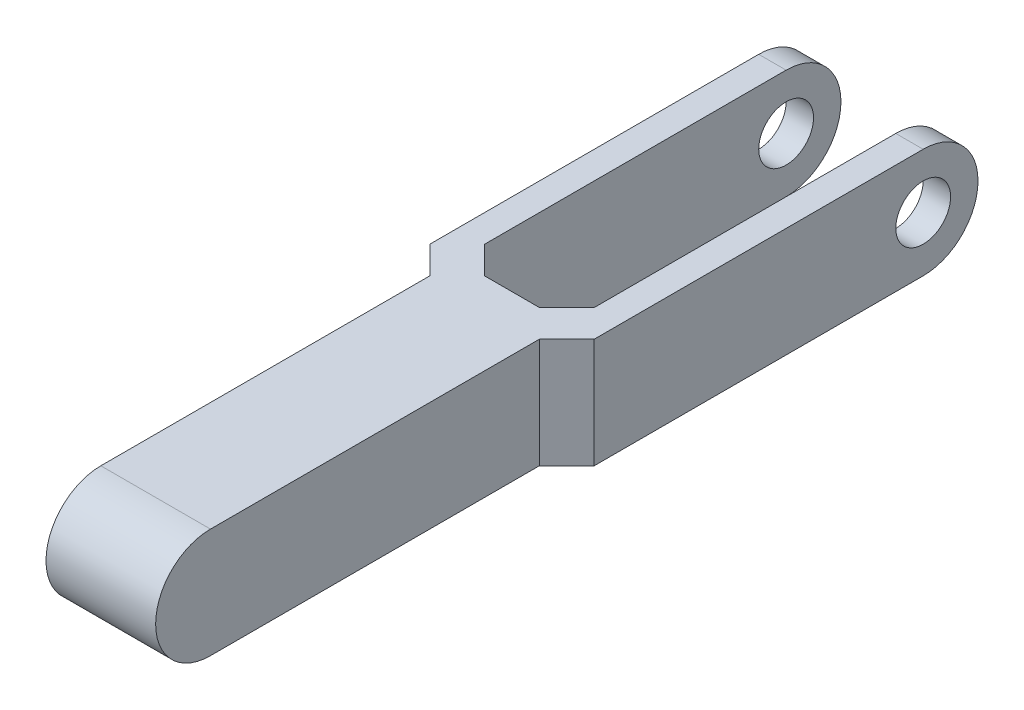
ISO-10303-21;
HEADER;
FILE_DESCRIPTION(('STEP AP214'),'2;1');
FILE_NAME('part.step','',(''),(''),'','','');
FILE_SCHEMA(('AUTOMOTIVE_DESIGN { 1 0 10303 214 1 1 1 1 }'));
ENDSEC;
DATA;
#1=APPLICATION_CONTEXT('core data for automotive mechanical design processes');
#2=APPLICATION_PROTOCOL_DEFINITION('international standard','automotive_design',2000,#1);
#3=PRODUCT_CONTEXT('',#1,'mechanical');
#4=PRODUCT('Part','Part','',(#3));
#5=PRODUCT_RELATED_PRODUCT_CATEGORY('part','',(#4));
#6=PRODUCT_DEFINITION_FORMATION('','',#4);
#7=PRODUCT_DEFINITION_CONTEXT('part definition',#1,'design');
#8=PRODUCT_DEFINITION('design','',#6,#7);
#9=PRODUCT_DEFINITION_SHAPE('','',#8);
#10=(LENGTH_UNIT() NAMED_UNIT(*) SI_UNIT(.MILLI.,.METRE.));
#11=(NAMED_UNIT(*) PLANE_ANGLE_UNIT() SI_UNIT($,.RADIAN.));
#12=(NAMED_UNIT(*) SI_UNIT($,.STERADIAN.) SOLID_ANGLE_UNIT());
#13=UNCERTAINTY_MEASURE_WITH_UNIT(LENGTH_MEASURE(1.E-05),#10,'distance_accuracy_value','');
#14=(GEOMETRIC_REPRESENTATION_CONTEXT(3) GLOBAL_UNCERTAINTY_ASSIGNED_CONTEXT((#13)) GLOBAL_UNIT_ASSIGNED_CONTEXT((#10,
#11,#12)) REPRESENTATION_CONTEXT('',''));
#15=CARTESIAN_POINT('',(0.,0.,0.));
#16=DIRECTION('',(0.,0.,1.));
#17=DIRECTION('',(1.,0.,0.));
#18=AXIS2_PLACEMENT_3D('',#15,#16,#17);
#19=CARTESIAN_POINT('',(30.,0.,0.));
#20=DIRECTION('',(-1.,0.,0.));
#21=DIRECTION('',(0.,0.,1.));
#22=AXIS2_PLACEMENT_3D('',#19,#20,#21);
#23=CYLINDRICAL_SURFACE('',#22,20.);
#24=CARTESIAN_POINT('',(20.0000000000001,0.,0.));
#25=DIRECTION('',(1.,0.,0.));
#26=DIRECTION('',(0.,0.,-1.));
#27=AXIS2_PLACEMENT_3D('',#24,#25,#26);
#28=CIRCLE('',#27,20.);
#29=CARTESIAN_POINT('',(20.0000000000001,20.,0.));
#30=VERTEX_POINT('',#29);
#31=CARTESIAN_POINT('',(20.0000000000001,-20.,0.));
#32=VERTEX_POINT('',#31);
#33=EDGE_CURVE('E11',#30,#32,#28,.T.);
#34=ORIENTED_EDGE('',*,*,#33,.F.);
#35=DIRECTION('',(-1.,0.,0.));
#36=VECTOR('',#35,1.);
#37=CARTESIAN_POINT('',(30.,20.,0.));
#38=LINE('',#37,#36);
#39=CARTESIAN_POINT('',(-20.,20.,0.));
#40=VERTEX_POINT('',#39);
#41=EDGE_CURVE('E182',#30,#40,#38,.T.);
#42=ORIENTED_EDGE('',*,*,#41,.T.);
#43=CARTESIAN_POINT('',(-20.,0.,0.));
#44=DIRECTION('',(1.,0.,0.));
#45=DIRECTION('',(0.,0.,-1.));
#46=AXIS2_PLACEMENT_3D('',#43,#44,#45);
#47=CIRCLE('',#46,20.);
#48=CARTESIAN_POINT('',(-20.,-20.,0.));
#49=VERTEX_POINT('',#48);
#50=EDGE_CURVE('E51',#40,#49,#47,.T.);
#51=ORIENTED_EDGE('',*,*,#50,.T.);
#52=DIRECTION('',(-1.,0.,0.));
#53=VECTOR('',#52,1.);
#54=CARTESIAN_POINT('',(30.,-20.,0.));
#55=LINE('',#54,#53);
#56=EDGE_CURVE('E192',#32,#49,#55,.T.);
#57=ORIENTED_EDGE('',*,*,#56,.F.);
#58=EDGE_LOOP('',(#34,#42,#51,#57));
#59=FACE_BOUND('',#58,.T.);
#60=ADVANCED_FACE('F43',(#59),#23,.T.);
#61=CARTESIAN_POINT('',(30.,-20.,0.));
#62=DIRECTION('',(0.,1.,0.));
#63=DIRECTION('',(0.,0.,1.));
#64=AXIS2_PLACEMENT_3D('',#61,#62,#63);
#65=PLANE('',#64);
#66=DIRECTION('',(0.707106781186547,0.,-0.707106781186548));
#67=VECTOR('',#66,1.);
#68=CARTESIAN_POINT('',(-50.,-20.,-49.9999999999999));
#69=LINE('',#68,#67);
#70=CARTESIAN_POINT('',(20.,-20.,-120.));
#71=VERTEX_POINT('',#70);
#72=CARTESIAN_POINT('',(30.,-20.,-130.));
#73=VERTEX_POINT('',#72);
#74=EDGE_CURVE('E296',#71,#73,#69,.T.);
#75=ORIENTED_EDGE('',*,*,#74,.F.);
#76=DIRECTION('',(0.,0.,-1.));
#77=VECTOR('',#76,1.);
#78=CARTESIAN_POINT('',(20.0000000000001,-20.,0.));
#79=LINE('',#78,#77);
#80=EDGE_CURVE('E299',#32,#71,#79,.T.);
#81=ORIENTED_EDGE('',*,*,#80,.F.);
#82=ORIENTED_EDGE('',*,*,#56,.T.);
#83=DIRECTION('',(0.,0.,-1.));
#84=VECTOR('',#83,1.);
#85=CARTESIAN_POINT('',(-20.,-20.,0.));
#86=LINE('',#85,#84);
#87=CARTESIAN_POINT('',(-20.,-20.,-120.));
#88=VERTEX_POINT('',#87);
#89=EDGE_CURVE('E59',#49,#88,#86,.T.);
#90=ORIENTED_EDGE('',*,*,#89,.T.);
#91=DIRECTION('',(0.707106781186547,0.,0.707106781186549));
#92=VECTOR('',#91,1.);
#93=CARTESIAN_POINT('',(50.,-20.,-49.9999999999998));
#94=LINE('',#93,#92);
#95=CARTESIAN_POINT('',(-30.,-20.,-130.));
#96=VERTEX_POINT('',#95);
#97=EDGE_CURVE('E146',#96,#88,#94,.T.);
#98=ORIENTED_EDGE('',*,*,#97,.F.);
#99=DIRECTION('',(0.,0.,-1.));
#100=VECTOR('',#99,1.);
#101=CARTESIAN_POINT('',(-30.,-20.,0.));
#102=LINE('',#101,#100);
#103=CARTESIAN_POINT('',(-30.,-20.,-250.));
#104=VERTEX_POINT('',#103);
#105=EDGE_CURVE('E165',#96,#104,#102,.T.);
#106=ORIENTED_EDGE('',*,*,#105,.T.);
#107=DIRECTION('',(-1.,0.,0.));
#108=VECTOR('',#107,1.);
#109=CARTESIAN_POINT('',(30.,-20.,-250.));
#110=LINE('',#109,#108);
#111=CARTESIAN_POINT('',(-20.,-20.,-250.));
#112=VERTEX_POINT('',#111);
#113=EDGE_CURVE('E188',#112,#104,#110,.T.);
#114=ORIENTED_EDGE('',*,*,#113,.F.);
#115=DIRECTION('',(0.,0.,1.));
#116=VECTOR('',#115,1.);
#117=CARTESIAN_POINT('',(-20.,-20.,0.));
#118=LINE('',#117,#116);
#119=CARTESIAN_POINT('',(-20.,-20.,-140.));
#120=VERTEX_POINT('',#119);
#121=EDGE_CURVE('E261',#112,#120,#118,.T.);
#122=ORIENTED_EDGE('',*,*,#121,.T.);
#123=DIRECTION('',(0.707106781186547,0.,0.707106781186549));
#124=VECTOR('',#123,1.);
#125=CARTESIAN_POINT('',(60.,-20.,-59.9999999999998));
#126=LINE('',#125,#124);
#127=CARTESIAN_POINT('',(-10.,-20.,-130.));
#128=VERTEX_POINT('',#127);
#129=EDGE_CURVE('E262',#120,#128,#126,.T.);
#130=ORIENTED_EDGE('',*,*,#129,.T.);
#131=DIRECTION('',(1.,0.,0.));
#132=VECTOR('',#131,1.);
#133=CARTESIAN_POINT('',(0.,-20.,-130.));
#134=LINE('',#133,#132);
#135=CARTESIAN_POINT('',(9.9999999999999,-20.,-130.));
#136=VERTEX_POINT('',#135);
#137=EDGE_CURVE('E271',#128,#136,#134,.T.);
#138=ORIENTED_EDGE('',*,*,#137,.T.);
#139=DIRECTION('',(-0.707106781186549,0.,0.707106781186546));
#140=VECTOR('',#139,1.);
#141=CARTESIAN_POINT('',(-60.0000000000001,-20.,-60.0000000000003));
#142=LINE('',#141,#140);
#143=CARTESIAN_POINT('',(20.0000000000001,-20.,-140.));
#144=VERTEX_POINT('',#143);
#145=EDGE_CURVE('E215',#144,#136,#142,.T.);
#146=ORIENTED_EDGE('',*,*,#145,.F.);
#147=DIRECTION('',(0.,0.,1.));
#148=VECTOR('',#147,1.);
#149=CARTESIAN_POINT('',(20.0000000000002,-20.,0.));
#150=LINE('',#149,#148);
#151=CARTESIAN_POINT('',(20.,-20.,-250.));
#152=VERTEX_POINT('',#151);
#153=EDGE_CURVE('E225',#152,#144,#150,.T.);
#154=ORIENTED_EDGE('',*,*,#153,.F.);
#155=CARTESIAN_POINT('',(30.,-20.,-250.));
#156=VERTEX_POINT('',#155);
#157=EDGE_CURVE('E190',#156,#152,#110,.T.);
#158=ORIENTED_EDGE('',*,*,#157,.F.);
#159=DIRECTION('',(0.,0.,-1.));
#160=VECTOR('',#159,1.);
#161=CARTESIAN_POINT('',(30.,-20.,0.));
#162=LINE('',#161,#160);
#163=EDGE_CURVE('E235',#73,#156,#162,.T.);
#164=ORIENTED_EDGE('',*,*,#163,.F.);
#165=EDGE_LOOP('',(#75,#81,#82,#90,#98,#106,#114,#122,#130,#138,#146,#154,#158,#164));
#166=FACE_BOUND('',#165,.T.);
#167=ADVANCED_FACE('F159',(#166),#65,.F.);
#168=CARTESIAN_POINT('',(30.,0.,-250.));
#169=DIRECTION('',(-1.,0.,0.));
#170=DIRECTION('',(0.,0.,1.));
#171=AXIS2_PLACEMENT_3D('',#168,#169,#170);
#172=CYLINDRICAL_SURFACE('',#171,20.);
#173=CARTESIAN_POINT('',(20.,0.,-250.));
#174=DIRECTION('',(-1.,0.,0.));
#175=DIRECTION('',(0.,0.,1.));
#176=AXIS2_PLACEMENT_3D('',#173,#174,#175);
#177=CIRCLE('',#176,20.);
#178=CARTESIAN_POINT('',(20.,20.,-250.));
#179=VERTEX_POINT('',#178);
#180=EDGE_CURVE('E175',#179,#152,#177,.T.);
#181=ORIENTED_EDGE('',*,*,#180,.F.);
#182=DIRECTION('',(-1.,0.,0.));
#183=VECTOR('',#182,1.);
#184=CARTESIAN_POINT('',(30.,20.,-250.));
#185=LINE('',#184,#183);
#186=CARTESIAN_POINT('',(30.,20.,-250.));
#187=VERTEX_POINT('',#186);
#188=EDGE_CURVE('E186',#187,#179,#185,.T.);
#189=ORIENTED_EDGE('',*,*,#188,.F.);
#190=CARTESIAN_POINT('',(30.,0.,-250.));
#191=DIRECTION('',(1.,0.,0.));
#192=DIRECTION('',(0.,0.,-1.));
#193=AXIS2_PLACEMENT_3D('',#190,#191,#192);
#194=CIRCLE('',#193,20.);
#195=EDGE_CURVE('E237',#156,#187,#194,.T.);
#196=ORIENTED_EDGE('',*,*,#195,.F.);
#197=ORIENTED_EDGE('',*,*,#157,.T.);
#198=EDGE_LOOP('',(#181,#189,#196,#197));
#199=FACE_BOUND('',#198,.T.);
#200=ADVANCED_FACE('F255',(#199),#172,.T.);
#201=CARTESIAN_POINT('',(-20.,20.,-250.));
#202=VERTEX_POINT('',#201);
#203=CARTESIAN_POINT('',(-30.,20.,-250.));
#204=VERTEX_POINT('',#203);
#205=EDGE_CURVE('E184',#202,#204,#185,.T.);
#206=ORIENTED_EDGE('',*,*,#205,.F.);
#207=CARTESIAN_POINT('',(-20.,0.,-250.));
#208=DIRECTION('',(-1.,0.,0.));
#209=DIRECTION('',(0.,0.,1.));
#210=AXIS2_PLACEMENT_3D('',#207,#208,#209);
#211=CIRCLE('',#210,20.);
#212=EDGE_CURVE('E200',#202,#112,#211,.T.);
#213=ORIENTED_EDGE('',*,*,#212,.T.);
#214=ORIENTED_EDGE('',*,*,#113,.T.);
#215=CARTESIAN_POINT('',(-30.,0.,-250.));
#216=DIRECTION('',(1.,0.,0.));
#217=DIRECTION('',(0.,0.,-1.));
#218=AXIS2_PLACEMENT_3D('',#215,#216,#217);
#219=CIRCLE('',#218,20.);
#220=EDGE_CURVE('E166',#104,#204,#219,.T.);
#221=ORIENTED_EDGE('',*,*,#220,.T.);
#222=EDGE_LOOP('',(#206,#213,#214,#221));
#223=FACE_BOUND('',#222,.T.);
#224=ADVANCED_FACE('F289',(#223),#172,.T.);
#225=CARTESIAN_POINT('',(30.,0.,-250.));
#226=DIRECTION('',(-1.,0.,0.));
#227=DIRECTION('',(0.,0.,1.));
#228=AXIS2_PLACEMENT_3D('',#225,#226,#227);
#229=CYLINDRICAL_SURFACE('',#228,9.99999999999998);
#230=CARTESIAN_POINT('',(30.,0.,-250.));
#231=DIRECTION('',(1.,0.,0.));
#232=DIRECTION('',(0.,0.,-1.));
#233=AXIS2_PLACEMENT_3D('',#230,#231,#232);
#234=CIRCLE('',#233,9.99999999999998);
#235=CARTESIAN_POINT('',(30.,0.,-260.));
#236=VERTEX_POINT('',#235);
#237=EDGE_CURVE('E176',#236,#236,#234,.T.);
#238=ORIENTED_EDGE('',*,*,#237,.T.);
#239=EDGE_LOOP('',(#238));
#240=FACE_BOUND('',#239,.T.);
#241=CARTESIAN_POINT('',(20.,0.,-250.));
#242=DIRECTION('',(-1.,0.,0.));
#243=DIRECTION('',(0.,0.,1.));
#244=AXIS2_PLACEMENT_3D('',#241,#242,#243);
#245=CIRCLE('',#244,9.99999999999998);
#246=CARTESIAN_POINT('',(20.,0.,-240.));
#247=VERTEX_POINT('',#246);
#248=EDGE_CURVE('E203',#247,#247,#245,.T.);
#249=ORIENTED_EDGE('',*,*,#248,.T.);
#250=EDGE_LOOP('',(#249));
#251=FACE_BOUND('',#250,.T.);
#252=ADVANCED_FACE('F317',(#240,#251),#229,.F.);
#253=CARTESIAN_POINT('',(30.,20.,0.));
#254=DIRECTION('',(0.,1.,0.));
#255=DIRECTION('',(0.,0.,1.));
#256=AXIS2_PLACEMENT_3D('',#253,#254,#255);
#257=PLANE('',#256);
#258=DIRECTION('',(0.,0.,-1.));
#259=VECTOR('',#258,1.);
#260=CARTESIAN_POINT('',(20.0000000000001,20.,0.));
#261=LINE('',#260,#259);
#262=CARTESIAN_POINT('',(20.,20.,-120.));
#263=VERTEX_POINT('',#262);
#264=EDGE_CURVE('E298',#30,#263,#261,.T.);
#265=ORIENTED_EDGE('',*,*,#264,.T.);
#266=DIRECTION('',(0.707106781186547,0.,-0.707106781186548));
#267=VECTOR('',#266,1.);
#268=CARTESIAN_POINT('',(-50.,20.,-49.9999999999999));
#269=LINE('',#268,#267);
#270=CARTESIAN_POINT('',(30.,20.,-130.));
#271=VERTEX_POINT('',#270);
#272=EDGE_CURVE('E243',#263,#271,#269,.T.);
#273=ORIENTED_EDGE('',*,*,#272,.T.);
#274=DIRECTION('',(0.,0.,-1.));
#275=VECTOR('',#274,1.);
#276=CARTESIAN_POINT('',(30.,20.,0.));
#277=LINE('',#276,#275);
#278=EDGE_CURVE('E183',#271,#187,#277,.T.);
#279=ORIENTED_EDGE('',*,*,#278,.T.);
#280=ORIENTED_EDGE('',*,*,#188,.T.);
#281=DIRECTION('',(0.,0.,1.));
#282=VECTOR('',#281,1.);
#283=CARTESIAN_POINT('',(20.0000000000002,20.,0.));
#284=LINE('',#283,#282);
#285=CARTESIAN_POINT('',(20.0000000000001,20.,-140.));
#286=VERTEX_POINT('',#285);
#287=EDGE_CURVE('E201',#179,#286,#284,.T.);
#288=ORIENTED_EDGE('',*,*,#287,.T.);
#289=DIRECTION('',(-0.707106781186549,0.,0.707106781186546));
#290=VECTOR('',#289,1.);
#291=CARTESIAN_POINT('',(-60.0000000000001,20.,-60.0000000000003));
#292=LINE('',#291,#290);
#293=CARTESIAN_POINT('',(9.9999999999999,20.,-130.));
#294=VERTEX_POINT('',#293);
#295=EDGE_CURVE('E219',#286,#294,#292,.T.);
#296=ORIENTED_EDGE('',*,*,#295,.T.);
#297=DIRECTION('',(1.,0.,0.));
#298=VECTOR('',#297,1.);
#299=CARTESIAN_POINT('',(0.,20.,-130.));
#300=LINE('',#299,#298);
#301=CARTESIAN_POINT('',(-10.,20.,-130.));
#302=VERTEX_POINT('',#301);
#303=EDGE_CURVE('E220',#302,#294,#300,.T.);
#304=ORIENTED_EDGE('',*,*,#303,.F.);
#305=DIRECTION('',(0.707106781186547,0.,0.707106781186549));
#306=VECTOR('',#305,1.);
#307=CARTESIAN_POINT('',(60.,20.,-59.9999999999998));
#308=LINE('',#307,#306);
#309=CARTESIAN_POINT('',(-19.9999999999999,20.,-140.));
#310=VERTEX_POINT('',#309);
#311=EDGE_CURVE('E214',#310,#302,#308,.T.);
#312=ORIENTED_EDGE('',*,*,#311,.F.);
#313=DIRECTION('',(0.,0.,1.));
#314=VECTOR('',#313,1.);
#315=CARTESIAN_POINT('',(-20.,20.,0.));
#316=LINE('',#315,#314);
#317=EDGE_CURVE('E191',#202,#310,#316,.T.);
#318=ORIENTED_EDGE('',*,*,#317,.F.);
#319=ORIENTED_EDGE('',*,*,#205,.T.);
#320=DIRECTION('',(0.,0.,-1.));
#321=VECTOR('',#320,1.);
#322=CARTESIAN_POINT('',(-30.,20.,0.));
#323=LINE('',#322,#321);
#324=CARTESIAN_POINT('',(-30.,20.,-130.));
#325=VERTEX_POINT('',#324);
#326=EDGE_CURVE('E172',#325,#204,#323,.T.);
#327=ORIENTED_EDGE('',*,*,#326,.F.);
#328=DIRECTION('',(0.707106781186547,0.,0.707106781186549));
#329=VECTOR('',#328,1.);
#330=CARTESIAN_POINT('',(50.,20.,-49.9999999999998));
#331=LINE('',#330,#329);
#332=CARTESIAN_POINT('',(-20.,20.,-120.));
#333=VERTEX_POINT('',#332);
#334=EDGE_CURVE('E147',#325,#333,#331,.T.);
#335=ORIENTED_EDGE('',*,*,#334,.T.);
#336=DIRECTION('',(0.,0.,-1.));
#337=VECTOR('',#336,1.);
#338=CARTESIAN_POINT('',(-20.,20.,0.));
#339=LINE('',#338,#337);
#340=EDGE_CURVE('E164',#40,#333,#339,.T.);
#341=ORIENTED_EDGE('',*,*,#340,.F.);
#342=ORIENTED_EDGE('',*,*,#41,.F.);
#343=EDGE_LOOP('',(#265,#273,#279,#280,#288,#296,#304,#312,#318,#319,#327,#335,#341,#342));
#344=FACE_BOUND('',#343,.T.);
#345=ADVANCED_FACE('F241',(#344),#257,.T.);
#346=CARTESIAN_POINT('',(-20.,0.,-250.));
#347=DIRECTION('',(-1.,0.,0.));
#348=DIRECTION('',(0.,0.,1.));
#349=AXIS2_PLACEMENT_3D('',#346,#347,#348);
#350=CIRCLE('',#349,9.99999999999998);
#351=CARTESIAN_POINT('',(-20.,0.,-240.));
#352=VERTEX_POINT('',#351);
#353=EDGE_CURVE('E198',#352,#352,#350,.T.);
#354=ORIENTED_EDGE('',*,*,#353,.F.);
#355=EDGE_LOOP('',(#354));
#356=FACE_BOUND('',#355,.T.);
#357=CARTESIAN_POINT('',(-30.,0.,-250.));
#358=DIRECTION('',(1.,0.,0.));
#359=DIRECTION('',(0.,0.,-1.));
#360=AXIS2_PLACEMENT_3D('',#357,#358,#359);
#361=CIRCLE('',#360,9.99999999999998);
#362=CARTESIAN_POINT('',(-30.,0.,-260.));
#363=VERTEX_POINT('',#362);
#364=EDGE_CURVE('E168',#363,#363,#361,.T.);
#365=ORIENTED_EDGE('',*,*,#364,.F.);
#366=EDGE_LOOP('',(#365));
#367=FACE_BOUND('',#366,.T.);
#368=ADVANCED_FACE('F44',(#356,#367),#229,.F.);
#369=CARTESIAN_POINT('',(30.,0.,0.));
#370=DIRECTION('',(1.,0.,0.));
#371=DIRECTION('',(0.,0.,-1.));
#372=AXIS2_PLACEMENT_3D('',#369,#370,#371);
#373=PLANE('',#372);
#374=DIRECTION('',(0.,1.,0.));
#375=VECTOR('',#374,1.);
#376=CARTESIAN_POINT('',(30.,-20.,-130.));
#377=LINE('',#376,#375);
#378=EDGE_CURVE('E286',#73,#271,#377,.T.);
#379=ORIENTED_EDGE('',*,*,#378,.F.);
#380=ORIENTED_EDGE('',*,*,#163,.T.);
#381=ORIENTED_EDGE('',*,*,#195,.T.);
#382=ORIENTED_EDGE('',*,*,#278,.F.);
#383=EDGE_LOOP('',(#379,#380,#381,#382));
#384=FACE_BOUND('',#383,.T.);
#385=ORIENTED_EDGE('',*,*,#237,.F.);
#386=EDGE_LOOP('',(#385));
#387=FACE_BOUND('',#386,.T.);
#388=ADVANCED_FACE('F247',(#384,#387),#373,.T.);
#389=CARTESIAN_POINT('',(-30.,0.,0.));
#390=DIRECTION('',(1.,0.,0.));
#391=DIRECTION('',(0.,0.,-1.));
#392=AXIS2_PLACEMENT_3D('',#389,#390,#391);
#393=PLANE('',#392);
#394=ORIENTED_EDGE('',*,*,#364,.T.);
#395=EDGE_LOOP('',(#394));
#396=FACE_BOUND('',#395,.T.);
#397=ORIENTED_EDGE('',*,*,#105,.F.);
#398=DIRECTION('',(0.,1.,0.));
#399=VECTOR('',#398,1.);
#400=CARTESIAN_POINT('',(-30.,-20.,-130.));
#401=LINE('',#400,#399);
#402=EDGE_CURVE('E145',#96,#325,#401,.T.);
#403=ORIENTED_EDGE('',*,*,#402,.T.);
#404=ORIENTED_EDGE('',*,*,#326,.T.);
#405=ORIENTED_EDGE('',*,*,#220,.F.);
#406=EDGE_LOOP('',(#397,#403,#404,#405));
#407=FACE_BOUND('',#406,.T.);
#408=ADVANCED_FACE('F170',(#396,#407),#393,.F.);
#409=CARTESIAN_POINT('',(20.0000000000002,-20.,0.));
#410=DIRECTION('',(-1.,0.,0.));
#411=DIRECTION('',(0.,0.,1.));
#412=AXIS2_PLACEMENT_3D('',#409,#410,#411);
#413=PLANE('',#412);
#414=ORIENTED_EDGE('',*,*,#248,.F.);
#415=EDGE_LOOP('',(#414));
#416=FACE_BOUND('',#415,.T.);
#417=ORIENTED_EDGE('',*,*,#180,.T.);
#418=ORIENTED_EDGE('',*,*,#153,.T.);
#419=DIRECTION('',(0.,1.,0.));
#420=VECTOR('',#419,1.);
#421=CARTESIAN_POINT('',(20.0000000000001,-20.,-140.));
#422=LINE('',#421,#420);
#423=EDGE_CURVE('E199',#144,#286,#422,.T.);
#424=ORIENTED_EDGE('',*,*,#423,.T.);
#425=ORIENTED_EDGE('',*,*,#287,.F.);
#426=EDGE_LOOP('',(#417,#418,#424,#425));
#427=FACE_BOUND('',#426,.T.);
#428=ADVANCED_FACE('F260',(#416,#427),#413,.T.);
#429=CARTESIAN_POINT('',(-20.,-20.,0.));
#430=DIRECTION('',(-1.,0.,0.));
#431=DIRECTION('',(0.,0.,1.));
#432=AXIS2_PLACEMENT_3D('',#429,#430,#431);
#433=PLANE('',#432);
#434=ORIENTED_EDGE('',*,*,#353,.T.);
#435=EDGE_LOOP('',(#434));
#436=FACE_BOUND('',#435,.T.);
#437=ORIENTED_EDGE('',*,*,#317,.T.);
#438=DIRECTION('',(0.,1.,0.));
#439=VECTOR('',#438,1.);
#440=CARTESIAN_POINT('',(-20.,-20.,-140.));
#441=LINE('',#440,#439);
#442=EDGE_CURVE('E68',#120,#310,#441,.T.);
#443=ORIENTED_EDGE('',*,*,#442,.F.);
#444=ORIENTED_EDGE('',*,*,#121,.F.);
#445=ORIENTED_EDGE('',*,*,#212,.F.);
#446=EDGE_LOOP('',(#437,#443,#444,#445));
#447=FACE_BOUND('',#446,.T.);
#448=ADVANCED_FACE('F285',(#436,#447),#433,.F.);
#449=CARTESIAN_POINT('',(-60.0000000000001,-20.,-60.0000000000003));
#450=DIRECTION('',(-0.707106781186546,0.,-0.707106781186549));
#451=DIRECTION('',(-0.707106781186549,0.,0.707106781186546));
#452=AXIS2_PLACEMENT_3D('',#449,#450,#451);
#453=PLANE('',#452);
#454=ORIENTED_EDGE('',*,*,#295,.F.);
#455=ORIENTED_EDGE('',*,*,#423,.F.);
#456=ORIENTED_EDGE('',*,*,#145,.T.);
#457=DIRECTION('',(0.,1.,0.));
#458=VECTOR('',#457,1.);
#459=CARTESIAN_POINT('',(9.9999999999999,-20.,-130.));
#460=LINE('',#459,#458);
#461=EDGE_CURVE('E223',#136,#294,#460,.T.);
#462=ORIENTED_EDGE('',*,*,#461,.T.);
#463=EDGE_LOOP('',(#454,#455,#456,#462));
#464=FACE_BOUND('',#463,.T.);
#465=ADVANCED_FACE('F274',(#464),#453,.T.);
#466=CARTESIAN_POINT('',(0.,-20.,-130.));
#467=DIRECTION('',(0.,0.,1.));
#468=DIRECTION('',(1.,0.,0.));
#469=AXIS2_PLACEMENT_3D('',#466,#467,#468);
#470=PLANE('',#469);
#471=ORIENTED_EDGE('',*,*,#303,.T.);
#472=ORIENTED_EDGE('',*,*,#461,.F.);
#473=ORIENTED_EDGE('',*,*,#137,.F.);
#474=DIRECTION('',(0.,1.,0.));
#475=VECTOR('',#474,1.);
#476=CARTESIAN_POINT('',(-10.,-20.,-130.));
#477=LINE('',#476,#475);
#478=EDGE_CURVE('E227',#128,#302,#477,.T.);
#479=ORIENTED_EDGE('',*,*,#478,.T.);
#480=EDGE_LOOP('',(#471,#472,#473,#479));
#481=FACE_BOUND('',#480,.T.);
#482=ADVANCED_FACE('F280',(#481),#470,.F.);
#483=CARTESIAN_POINT('',(60.,-20.,-59.9999999999998));
#484=DIRECTION('',(-0.707106781186549,0.,0.707106781186547));
#485=DIRECTION('',(0.707106781186547,0.,0.707106781186549));
#486=AXIS2_PLACEMENT_3D('',#483,#484,#485);
#487=PLANE('',#486);
#488=ORIENTED_EDGE('',*,*,#311,.T.);
#489=ORIENTED_EDGE('',*,*,#478,.F.);
#490=ORIENTED_EDGE('',*,*,#129,.F.);
#491=ORIENTED_EDGE('',*,*,#442,.T.);
#492=EDGE_LOOP('',(#488,#489,#490,#491));
#493=FACE_BOUND('',#492,.T.);
#494=ADVANCED_FACE('F282',(#493),#487,.F.);
#495=CARTESIAN_POINT('',(-20.,-20.,0.));
#496=DIRECTION('',(1.,0.,0.));
#497=DIRECTION('',(0.,0.,-1.));
#498=AXIS2_PLACEMENT_3D('',#495,#496,#497);
#499=PLANE('',#498);
#500=ORIENTED_EDGE('',*,*,#340,.T.);
#501=DIRECTION('',(0.,1.,0.));
#502=VECTOR('',#501,1.);
#503=CARTESIAN_POINT('',(-20.,-20.,-120.));
#504=LINE('',#503,#502);
#505=EDGE_CURVE('E154',#88,#333,#504,.T.);
#506=ORIENTED_EDGE('',*,*,#505,.F.);
#507=ORIENTED_EDGE('',*,*,#89,.F.);
#508=ORIENTED_EDGE('',*,*,#50,.F.);
#509=EDGE_LOOP('',(#500,#506,#507,#508));
#510=FACE_BOUND('',#509,.T.);
#511=ADVANCED_FACE('F334',(#510),#499,.F.);
#512=CARTESIAN_POINT('',(50.,-20.,-49.9999999999998));
#513=DIRECTION('',(-0.707106781186549,0.,0.707106781186547));
#514=DIRECTION('',(0.707106781186547,0.,0.707106781186549));
#515=AXIS2_PLACEMENT_3D('',#512,#513,#514);
#516=PLANE('',#515);
#517=ORIENTED_EDGE('',*,*,#334,.F.);
#518=ORIENTED_EDGE('',*,*,#402,.F.);
#519=ORIENTED_EDGE('',*,*,#97,.T.);
#520=ORIENTED_EDGE('',*,*,#505,.T.);
#521=EDGE_LOOP('',(#517,#518,#519,#520));
#522=FACE_BOUND('',#521,.T.);
#523=ADVANCED_FACE('F148',(#522),#516,.T.);
#524=CARTESIAN_POINT('',(20.0000000000001,-20.,0.));
#525=DIRECTION('',(1.,0.,0.));
#526=DIRECTION('',(0.,0.,-1.));
#527=AXIS2_PLACEMENT_3D('',#524,#525,#526);
#528=PLANE('',#527);
#529=ORIENTED_EDGE('',*,*,#264,.F.);
#530=ORIENTED_EDGE('',*,*,#33,.T.);
#531=ORIENTED_EDGE('',*,*,#80,.T.);
#532=DIRECTION('',(0.,1.,0.));
#533=VECTOR('',#532,1.);
#534=CARTESIAN_POINT('',(20.,-20.,-120.));
#535=LINE('',#534,#533);
#536=EDGE_CURVE('E270',#71,#263,#535,.T.);
#537=ORIENTED_EDGE('',*,*,#536,.T.);
#538=EDGE_LOOP('',(#529,#530,#531,#537));
#539=FACE_BOUND('',#538,.T.);
#540=ADVANCED_FACE('F305',(#539),#528,.T.);
#541=CARTESIAN_POINT('',(-50.,-20.,-49.9999999999999));
#542=DIRECTION('',(0.707106781186548,0.,0.707106781186547));
#543=DIRECTION('',(0.707106781186547,0.,-0.707106781186548));
#544=AXIS2_PLACEMENT_3D('',#541,#542,#543);
#545=PLANE('',#544);
#546=ORIENTED_EDGE('',*,*,#272,.F.);
#547=ORIENTED_EDGE('',*,*,#536,.F.);
#548=ORIENTED_EDGE('',*,*,#74,.T.);
#549=ORIENTED_EDGE('',*,*,#378,.T.);
#550=EDGE_LOOP('',(#546,#547,#548,#549));
#551=FACE_BOUND('',#550,.T.);
#552=ADVANCED_FACE('F306',(#551),#545,.T.);
#553=CLOSED_SHELL('',(#60,#167,#200,#224,#252,#345,#368,#388,#408,#428,#448,#465,#482,#494,#511,
#523,#540,#552));
#554=MANIFOLD_SOLID_BREP('B2',#553);
#555=ADVANCED_BREP_SHAPE_REPRESENTATION('',(#18,#554),#14);
#556=SHAPE_DEFINITION_REPRESENTATION(#9,#555);
ENDSEC;
END-ISO-10303-21;
